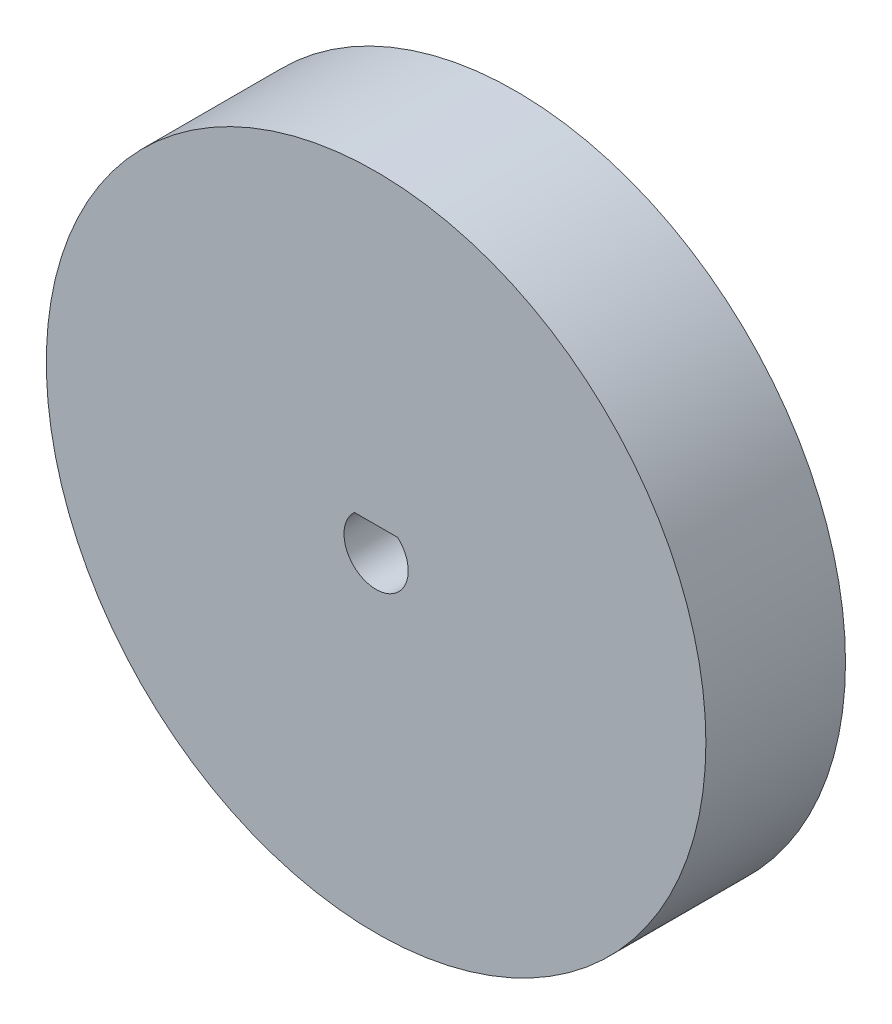
ISO-10303-21;
HEADER;
FILE_DESCRIPTION(('STEP AP214'),'2;1');
FILE_NAME('part.step','',(''),(''),'','','');
FILE_SCHEMA(('AUTOMOTIVE_DESIGN { 1 0 10303 214 1 1 1 1 }'));
ENDSEC;
DATA;
#1=APPLICATION_CONTEXT('core data for automotive mechanical design processes');
#2=APPLICATION_PROTOCOL_DEFINITION('international standard','automotive_design',2000,#1);
#3=PRODUCT_CONTEXT('',#1,'mechanical');
#4=PRODUCT('Part','Part','',(#3));
#5=PRODUCT_RELATED_PRODUCT_CATEGORY('part','',(#4));
#6=PRODUCT_DEFINITION_FORMATION('','',#4);
#7=PRODUCT_DEFINITION_CONTEXT('part definition',#1,'design');
#8=PRODUCT_DEFINITION('design','',#6,#7);
#9=PRODUCT_DEFINITION_SHAPE('','',#8);
#10=(LENGTH_UNIT() NAMED_UNIT(*) SI_UNIT(.MILLI.,.METRE.));
#11=(NAMED_UNIT(*) PLANE_ANGLE_UNIT() SI_UNIT($,.RADIAN.));
#12=(NAMED_UNIT(*) SI_UNIT($,.STERADIAN.) SOLID_ANGLE_UNIT());
#13=UNCERTAINTY_MEASURE_WITH_UNIT(LENGTH_MEASURE(1.E-05),#10,'distance_accuracy_value','');
#14=(GEOMETRIC_REPRESENTATION_CONTEXT(3) GLOBAL_UNCERTAINTY_ASSIGNED_CONTEXT((#13)) GLOBAL_UNIT_ASSIGNED_CONTEXT((#10,
#11,#12)) REPRESENTATION_CONTEXT('',''));
#15=CARTESIAN_POINT('',(0.,0.,0.));
#16=DIRECTION('',(0.,0.,1.));
#17=DIRECTION('',(1.,0.,0.));
#18=AXIS2_PLACEMENT_3D('',#15,#16,#17);
#19=CARTESIAN_POINT('',(0.,0.,12.7));
#20=DIRECTION('',(0.,0.,1.));
#21=DIRECTION('',(1.,0.,0.));
#22=AXIS2_PLACEMENT_3D('',#19,#20,#21);
#23=PLANE('',#22);
#24=CARTESIAN_POINT('',(0.,0.,12.7));
#25=DIRECTION('',(0.,0.,1.));
#26=DIRECTION('',(1.,0.,0.));
#27=AXIS2_PLACEMENT_3D('',#24,#25,#26);
#28=CIRCLE('',#27,29.999999944);
#29=CARTESIAN_POINT('',(29.999999944,0.,12.7));
#30=VERTEX_POINT('',#29);
#31=EDGE_CURVE('E11',#30,#30,#28,.T.);
#32=ORIENTED_EDGE('',*,*,#31,.T.);
#33=EDGE_LOOP('',(#32));
#34=FACE_BOUND('',#33,.T.);
#35=DIRECTION('',(-1.,0.,0.));
#36=VECTOR('',#35,1.);
#37=CARTESIAN_POINT('',(0.,2.159,12.7));
#38=LINE('',#37,#36);
#39=CARTESIAN_POINT('',(1.96747553987337,2.159,12.7));
#40=VERTEX_POINT('',#39);
#41=CARTESIAN_POINT('',(-1.96747553987337,2.159,12.7));
#42=VERTEX_POINT('',#41);
#43=EDGE_CURVE('E74',#40,#42,#38,.T.);
#44=ORIENTED_EDGE('',*,*,#43,.F.);
#45=CARTESIAN_POINT('',(0.,0.,12.7));
#46=DIRECTION('',(0.,0.,-1.));
#47=DIRECTION('',(-1.,0.,0.));
#48=AXIS2_PLACEMENT_3D('',#45,#46,#47);
#49=CIRCLE('',#48,2.921);
#50=EDGE_CURVE('E65',#42,#40,#49,.F.);
#51=ORIENTED_EDGE('',*,*,#50,.F.);
#52=EDGE_LOOP('',(#44,#51));
#53=FACE_BOUND('',#52,.T.);
#54=ADVANCED_FACE('F33',(#34,#53),#23,.T.);
#55=CARTESIAN_POINT('',(0.,0.,0.));
#56=DIRECTION('',(0.,0.,1.));
#57=DIRECTION('',(1.,0.,0.));
#58=AXIS2_PLACEMENT_3D('',#55,#56,#57);
#59=PLANE('',#58);
#60=CARTESIAN_POINT('',(0.,0.,0.));
#61=DIRECTION('',(0.,0.,1.));
#62=DIRECTION('',(1.,0.,0.));
#63=AXIS2_PLACEMENT_3D('',#60,#61,#62);
#64=CIRCLE('',#63,29.999999944);
#65=CARTESIAN_POINT('',(29.999999944,0.,0.));
#66=VERTEX_POINT('',#65);
#67=EDGE_CURVE('E37',#66,#66,#64,.T.);
#68=ORIENTED_EDGE('',*,*,#67,.F.);
#69=EDGE_LOOP('',(#68));
#70=FACE_BOUND('',#69,.T.);
#71=CARTESIAN_POINT('',(0.,0.,0.));
#72=DIRECTION('',(0.,0.,-1.));
#73=DIRECTION('',(-1.,0.,0.));
#74=AXIS2_PLACEMENT_3D('',#71,#72,#73);
#75=CIRCLE('',#74,2.921);
#76=CARTESIAN_POINT('',(-1.96747553987337,2.159,0.));
#77=VERTEX_POINT('',#76);
#78=CARTESIAN_POINT('',(1.96747553987337,2.159,0.));
#79=VERTEX_POINT('',#78);
#80=EDGE_CURVE('E55',#77,#79,#75,.F.);
#81=ORIENTED_EDGE('',*,*,#80,.T.);
#82=DIRECTION('',(-1.,0.,0.));
#83=VECTOR('',#82,1.);
#84=CARTESIAN_POINT('',(0.,2.159,0.));
#85=LINE('',#84,#83);
#86=EDGE_CURVE('E61',#79,#77,#85,.T.);
#87=ORIENTED_EDGE('',*,*,#86,.T.);
#88=EDGE_LOOP('',(#81,#87));
#89=FACE_BOUND('',#88,.T.);
#90=ADVANCED_FACE('F71',(#70,#89),#59,.F.);
#91=CARTESIAN_POINT('',(0.,0.,12.7));
#92=DIRECTION('',(0.,0.,-1.));
#93=DIRECTION('',(-1.,0.,0.));
#94=AXIS2_PLACEMENT_3D('',#91,#92,#93);
#95=CYLINDRICAL_SURFACE('',#94,29.999999944);
#96=ORIENTED_EDGE('',*,*,#31,.F.);
#97=EDGE_LOOP('',(#96));
#98=FACE_BOUND('',#97,.T.);
#99=ORIENTED_EDGE('',*,*,#67,.T.);
#100=EDGE_LOOP('',(#99));
#101=FACE_BOUND('',#100,.T.);
#102=ADVANCED_FACE('F35',(#98,#101),#95,.T.);
#103=CARTESIAN_POINT('',(0.,0.,12.7));
#104=DIRECTION('',(0.,0.,-1.));
#105=DIRECTION('',(-1.,0.,0.));
#106=AXIS2_PLACEMENT_3D('',#103,#104,#105);
#107=CYLINDRICAL_SURFACE('',#106,2.921);
#108=ORIENTED_EDGE('',*,*,#80,.F.);
#109=DIRECTION('',(0.,0.,-1.));
#110=VECTOR('',#109,1.);
#111=CARTESIAN_POINT('',(-1.96747553987337,2.159,12.7));
#112=LINE('',#111,#110);
#113=EDGE_CURVE('E63',#42,#77,#112,.T.);
#114=ORIENTED_EDGE('',*,*,#113,.F.);
#115=ORIENTED_EDGE('',*,*,#50,.T.);
#116=DIRECTION('',(0.,0.,-1.));
#117=VECTOR('',#116,1.);
#118=CARTESIAN_POINT('',(1.96747553987337,2.159,12.7));
#119=LINE('',#118,#117);
#120=EDGE_CURVE('E48',#40,#79,#119,.T.);
#121=ORIENTED_EDGE('',*,*,#120,.T.);
#122=EDGE_LOOP('',(#108,#114,#115,#121));
#123=FACE_BOUND('',#122,.T.);
#124=ADVANCED_FACE('F67',(#123),#107,.F.);
#125=CARTESIAN_POINT('',(0.,2.159,12.7));
#126=DIRECTION('',(0.,-1.,0.));
#127=DIRECTION('',(0.,0.,-1.));
#128=AXIS2_PLACEMENT_3D('',#125,#126,#127);
#129=PLANE('',#128);
#130=ORIENTED_EDGE('',*,*,#86,.F.);
#131=ORIENTED_EDGE('',*,*,#120,.F.);
#132=ORIENTED_EDGE('',*,*,#43,.T.);
#133=ORIENTED_EDGE('',*,*,#113,.T.);
#134=EDGE_LOOP('',(#130,#131,#132,#133));
#135=FACE_BOUND('',#134,.T.);
#136=ADVANCED_FACE('F62',(#135),#129,.T.);
#137=CLOSED_SHELL('',(#54,#90,#102,#124,#136));
#138=MANIFOLD_SOLID_BREP('B2',#137);
#139=ADVANCED_BREP_SHAPE_REPRESENTATION('',(#18,#138),#14);
#140=SHAPE_DEFINITION_REPRESENTATION(#9,#139);
ENDSEC;
END-ISO-10303-21;
